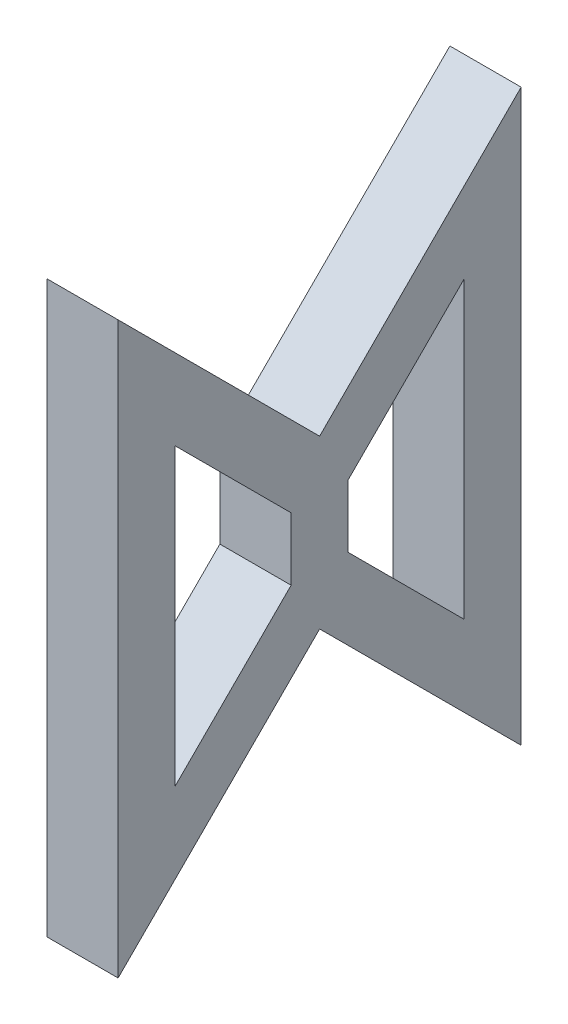
ISO-10303-21;
HEADER;
FILE_DESCRIPTION(('STEP AP214'),'2;1');
FILE_NAME('part.step','',(''),(''),'','','');
FILE_SCHEMA(('AUTOMOTIVE_DESIGN { 1 0 10303 214 1 1 1 1 }'));
ENDSEC;
DATA;
#1=APPLICATION_CONTEXT('core data for automotive mechanical design processes');
#2=APPLICATION_PROTOCOL_DEFINITION('international standard','automotive_design',2000,#1);
#3=PRODUCT_CONTEXT('',#1,'mechanical');
#4=PRODUCT('Part','Part','',(#3));
#5=PRODUCT_RELATED_PRODUCT_CATEGORY('part','',(#4));
#6=PRODUCT_DEFINITION_FORMATION('','',#4);
#7=PRODUCT_DEFINITION_CONTEXT('part definition',#1,'design');
#8=PRODUCT_DEFINITION('design','',#6,#7);
#9=PRODUCT_DEFINITION_SHAPE('','',#8);
#10=(LENGTH_UNIT() NAMED_UNIT(*) SI_UNIT(.MILLI.,.METRE.));
#11=(NAMED_UNIT(*) PLANE_ANGLE_UNIT() SI_UNIT($,.RADIAN.));
#12=(NAMED_UNIT(*) SI_UNIT($,.STERADIAN.) SOLID_ANGLE_UNIT());
#13=UNCERTAINTY_MEASURE_WITH_UNIT(LENGTH_MEASURE(1.E-05),#10,'distance_accuracy_value','');
#14=(GEOMETRIC_REPRESENTATION_CONTEXT(3) GLOBAL_UNCERTAINTY_ASSIGNED_CONTEXT((#13)) GLOBAL_UNIT_ASSIGNED_CONTEXT((#10,
#11,#12)) REPRESENTATION_CONTEXT('',''));
#15=CARTESIAN_POINT('',(0.,0.,0.));
#16=DIRECTION('',(0.,0.,1.));
#17=DIRECTION('',(1.,0.,0.));
#18=AXIS2_PLACEMENT_3D('',#15,#16,#17);
#19=CARTESIAN_POINT('',(5.,0.,0.));
#20=DIRECTION('',(0.,0.,-1.));
#21=DIRECTION('',(0.,1.,0.));
#22=AXIS2_PLACEMENT_3D('',#19,#20,#21);
#23=PLANE('',#22);
#24=DIRECTION('',(0.,-1.,0.));
#25=VECTOR('',#24,1.);
#26=CARTESIAN_POINT('',(0.,0.,0.));
#27=LINE('',#26,#25);
#28=CARTESIAN_POINT('',(0.,0.,0.));
#29=VERTEX_POINT('',#28);
#30=CARTESIAN_POINT('',(0.,-40.,0.));
#31=VERTEX_POINT('',#30);
#32=EDGE_CURVE('E196',#29,#31,#27,.T.);
#33=ORIENTED_EDGE('',*,*,#32,.T.);
#34=DIRECTION('',(-1.,0.,0.));
#35=VECTOR('',#34,1.);
#36=CARTESIAN_POINT('',(5.,-40.,0.));
#37=LINE('',#36,#35);
#38=CARTESIAN_POINT('',(5.,-40.,0.));
#39=VERTEX_POINT('',#38);
#40=EDGE_CURVE('E11',#39,#31,#37,.T.);
#41=ORIENTED_EDGE('',*,*,#40,.F.);
#42=DIRECTION('',(0.,-1.,0.));
#43=VECTOR('',#42,1.);
#44=CARTESIAN_POINT('',(5.,0.,0.));
#45=LINE('',#44,#43);
#46=CARTESIAN_POINT('',(5.,0.,0.));
#47=VERTEX_POINT('',#46);
#48=EDGE_CURVE('E203',#47,#39,#45,.T.);
#49=ORIENTED_EDGE('',*,*,#48,.F.);
#50=DIRECTION('',(-1.,0.,0.));
#51=VECTOR('',#50,1.);
#52=CARTESIAN_POINT('',(5.,0.,0.));
#53=LINE('',#52,#51);
#54=EDGE_CURVE('E220',#47,#29,#53,.T.);
#55=ORIENTED_EDGE('',*,*,#54,.T.);
#56=EDGE_LOOP('',(#33,#41,#49,#55));
#57=FACE_BOUND('',#56,.T.);
#58=ADVANCED_FACE('F35',(#57),#23,.F.);
#59=CARTESIAN_POINT('',(5.,-20.0000000000001,-20.));
#60=DIRECTION('',(0.,0.707106781186549,0.707106781186546));
#61=DIRECTION('',(0.,-0.707106781186546,0.707106781186549));
#62=AXIS2_PLACEMENT_3D('',#59,#60,#61);
#63=PLANE('',#62);
#64=DIRECTION('',(0.,0.707106781186546,-0.707106781186549));
#65=VECTOR('',#64,1.);
#66=CARTESIAN_POINT('',(0.,-20.0000000000001,-20.));
#67=LINE('',#66,#65);
#68=CARTESIAN_POINT('',(0.,-25.8578643762691,-14.142135623731));
#69=VERTEX_POINT('',#68);
#70=EDGE_CURVE('E223',#31,#69,#67,.T.);
#71=ORIENTED_EDGE('',*,*,#70,.T.);
#72=DIRECTION('',(-1.,0.,0.));
#73=VECTOR('',#72,1.);
#74=CARTESIAN_POINT('',(5.,-25.8578643762691,-14.142135623731));
#75=LINE('',#74,#73);
#76=CARTESIAN_POINT('',(5.,-25.8578643762691,-14.142135623731));
#77=VERTEX_POINT('',#76);
#78=EDGE_CURVE('E42',#77,#69,#75,.T.);
#79=ORIENTED_EDGE('',*,*,#78,.F.);
#80=DIRECTION('',(0.,0.707106781186546,-0.707106781186549));
#81=VECTOR('',#80,1.);
#82=CARTESIAN_POINT('',(5.,-20.0000000000001,-20.));
#83=LINE('',#82,#81);
#84=EDGE_CURVE('E206',#39,#77,#83,.T.);
#85=ORIENTED_EDGE('',*,*,#84,.F.);
#86=ORIENTED_EDGE('',*,*,#40,.T.);
#87=EDGE_LOOP('',(#71,#79,#85,#86));
#88=FACE_BOUND('',#87,.T.);
#89=ADVANCED_FACE('F269',(#88),#63,.F.);
#90=CARTESIAN_POINT('',(5.,-5.8578643762691,5.85786437626908));
#91=DIRECTION('',(0.,0.707106781186549,-0.707106781186546));
#92=DIRECTION('',(0.,0.707106781186546,0.707106781186549));
#93=AXIS2_PLACEMENT_3D('',#90,#91,#92);
#94=PLANE('',#93);
#95=DIRECTION('',(0.,-0.707106781186546,-0.707106781186549));
#96=VECTOR('',#95,1.);
#97=CARTESIAN_POINT('',(0.,-5.8578643762691,5.85786437626908));
#98=LINE('',#97,#96);
#99=CARTESIAN_POINT('',(0.,-40.,-28.2842712474619));
#100=VERTEX_POINT('',#99);
#101=EDGE_CURVE('E225',#69,#100,#98,.T.);
#102=ORIENTED_EDGE('',*,*,#101,.T.);
#103=DIRECTION('',(-1.,0.,0.));
#104=VECTOR('',#103,1.);
#105=CARTESIAN_POINT('',(5.,-40.,-28.2842712474619));
#106=LINE('',#105,#104);
#107=CARTESIAN_POINT('',(5.,-40.,-28.2842712474619));
#108=VERTEX_POINT('',#107);
#109=EDGE_CURVE('E241',#108,#100,#106,.T.);
#110=ORIENTED_EDGE('',*,*,#109,.F.);
#111=DIRECTION('',(0.,-0.707106781186546,-0.707106781186549));
#112=VECTOR('',#111,1.);
#113=CARTESIAN_POINT('',(5.,-5.8578643762691,5.85786437626908));
#114=LINE('',#113,#112);
#115=EDGE_CURVE('E209',#77,#108,#114,.T.);
#116=ORIENTED_EDGE('',*,*,#115,.F.);
#117=ORIENTED_EDGE('',*,*,#78,.T.);
#118=EDGE_LOOP('',(#102,#110,#116,#117));
#119=FACE_BOUND('',#118,.T.);
#120=ADVANCED_FACE('F247',(#119),#94,.F.);
#121=CARTESIAN_POINT('',(5.,0.,-28.2842712474619));
#122=DIRECTION('',(0.,0.,-1.));
#123=DIRECTION('',(-1.,0.,0.));
#124=AXIS2_PLACEMENT_3D('',#121,#122,#123);
#125=PLANE('',#124);
#126=DIRECTION('',(0.,-1.,0.));
#127=VECTOR('',#126,1.);
#128=CARTESIAN_POINT('',(0.,0.,-28.2842712474619));
#129=LINE('',#128,#127);
#130=CARTESIAN_POINT('',(0.,0.,-28.2842712474619));
#131=VERTEX_POINT('',#130);
#132=EDGE_CURVE('E228',#131,#100,#129,.T.);
#133=ORIENTED_EDGE('',*,*,#132,.F.);
#134=DIRECTION('',(-1.,0.,0.));
#135=VECTOR('',#134,1.);
#136=CARTESIAN_POINT('',(5.,0.,-28.2842712474619));
#137=LINE('',#136,#135);
#138=CARTESIAN_POINT('',(5.,0.,-28.2842712474619));
#139=VERTEX_POINT('',#138);
#140=EDGE_CURVE('E239',#139,#131,#137,.T.);
#141=ORIENTED_EDGE('',*,*,#140,.F.);
#142=DIRECTION('',(0.,-1.,0.));
#143=VECTOR('',#142,1.);
#144=CARTESIAN_POINT('',(5.,0.,-28.2842712474619));
#145=LINE('',#144,#143);
#146=EDGE_CURVE('E211',#139,#108,#145,.T.);
#147=ORIENTED_EDGE('',*,*,#146,.T.);
#148=ORIENTED_EDGE('',*,*,#109,.T.);
#149=EDGE_LOOP('',(#133,#141,#147,#148));
#150=FACE_BOUND('',#149,.T.);
#151=ADVANCED_FACE('F255',(#150),#125,.T.);
#152=CARTESIAN_POINT('',(5.,-14.142135623731,-14.1421356237309));
#153=DIRECTION('',(0.,0.707106781186549,0.707106781186546));
#154=DIRECTION('',(0.,-0.707106781186546,0.707106781186549));
#155=AXIS2_PLACEMENT_3D('',#152,#153,#154);
#156=PLANE('',#155);
#157=DIRECTION('',(0.,0.707106781186546,-0.707106781186549));
#158=VECTOR('',#157,1.);
#159=CARTESIAN_POINT('',(0.,-14.142135623731,-14.1421356237309));
#160=LINE('',#159,#158);
#161=CARTESIAN_POINT('',(0.,-14.1421356237309,-14.142135623731));
#162=VERTEX_POINT('',#161);
#163=EDGE_CURVE('E231',#162,#131,#160,.T.);
#164=ORIENTED_EDGE('',*,*,#163,.F.);
#165=DIRECTION('',(-1.,0.,0.));
#166=VECTOR('',#165,1.);
#167=CARTESIAN_POINT('',(5.,-14.1421356237309,-14.142135623731));
#168=LINE('',#167,#166);
#169=CARTESIAN_POINT('',(5.,-14.1421356237309,-14.142135623731));
#170=VERTEX_POINT('',#169);
#171=EDGE_CURVE('E237',#170,#162,#168,.T.);
#172=ORIENTED_EDGE('',*,*,#171,.F.);
#173=DIRECTION('',(0.,0.707106781186546,-0.707106781186549));
#174=VECTOR('',#173,1.);
#175=CARTESIAN_POINT('',(5.,-14.142135623731,-14.1421356237309));
#176=LINE('',#175,#174);
#177=EDGE_CURVE('E214',#170,#139,#176,.T.);
#178=ORIENTED_EDGE('',*,*,#177,.T.);
#179=ORIENTED_EDGE('',*,*,#140,.T.);
#180=EDGE_LOOP('',(#164,#172,#178,#179));
#181=FACE_BOUND('',#180,.T.);
#182=ADVANCED_FACE('F262',(#181),#156,.T.);
#183=CARTESIAN_POINT('',(5.,0.,0.));
#184=DIRECTION('',(0.,0.707106781186549,-0.707106781186546));
#185=DIRECTION('',(0.,0.707106781186546,0.707106781186549));
#186=AXIS2_PLACEMENT_3D('',#183,#184,#185);
#187=PLANE('',#186);
#188=DIRECTION('',(0.,-0.707106781186546,-0.707106781186549));
#189=VECTOR('',#188,1.);
#190=CARTESIAN_POINT('',(0.,0.,0.));
#191=LINE('',#190,#189);
#192=EDGE_CURVE('E207',#29,#162,#191,.T.);
#193=ORIENTED_EDGE('',*,*,#192,.F.);
#194=ORIENTED_EDGE('',*,*,#54,.F.);
#195=DIRECTION('',(0.,-0.707106781186546,-0.707106781186549));
#196=VECTOR('',#195,1.);
#197=CARTESIAN_POINT('',(5.,0.,0.));
#198=LINE('',#197,#196);
#199=EDGE_CURVE('E217',#47,#170,#198,.T.);
#200=ORIENTED_EDGE('',*,*,#199,.T.);
#201=ORIENTED_EDGE('',*,*,#171,.T.);
#202=EDGE_LOOP('',(#193,#194,#200,#201));
#203=FACE_BOUND('',#202,.T.);
#204=ADVANCED_FACE('F265',(#203),#187,.T.);
#205=CARTESIAN_POINT('',(5.,0.,0.));
#206=DIRECTION('',(1.,0.,0.));
#207=DIRECTION('',(0.,0.,-1.));
#208=AXIS2_PLACEMENT_3D('',#205,#206,#207);
#209=PLANE('',#208);
#210=DIRECTION('',(0.,1.,0.));
#211=VECTOR('',#210,1.);
#212=CARTESIAN_POINT('',(5.,0.,-24.2842712474619));
#213=LINE('',#212,#211);
#214=CARTESIAN_POINT('',(5.,-30.3431457505076,-24.2842712474619));
#215=VERTEX_POINT('',#214);
#216=CARTESIAN_POINT('',(5.,-9.65685424949236,-24.2842712474619));
#217=VERTEX_POINT('',#216);
#218=EDGE_CURVE('E49',#215,#217,#213,.T.);
#219=ORIENTED_EDGE('',*,*,#218,.F.);
#220=DIRECTION('',(0.,-0.707106781186546,-0.707106781186549));
#221=VECTOR('',#220,1.);
#222=CARTESIAN_POINT('',(5.,-3.0294372515229,3.02943725152289));
#223=LINE('',#222,#221);
#224=CARTESIAN_POINT('',(5.,-22.2010101267767,-16.142135623731));
#225=VERTEX_POINT('',#224);
#226=EDGE_CURVE('E152',#225,#215,#223,.T.);
#227=ORIENTED_EDGE('',*,*,#226,.F.);
#228=DIRECTION('',(0.,1.,0.));
#229=VECTOR('',#228,1.);
#230=CARTESIAN_POINT('',(5.,0.,-16.142135623731));
#231=LINE('',#230,#229);
#232=CARTESIAN_POINT('',(5.,-17.7989898732233,-16.142135623731));
#233=VERTEX_POINT('',#232);
#234=EDGE_CURVE('E155',#225,#233,#231,.T.);
#235=ORIENTED_EDGE('',*,*,#234,.T.);
#236=DIRECTION('',(0.,-0.707106781186546,0.707106781186549));
#237=VECTOR('',#236,1.);
#238=CARTESIAN_POINT('',(5.,-16.9705627484772,-16.9705627484771));
#239=LINE('',#238,#237);
#240=EDGE_CURVE('E161',#217,#233,#239,.T.);
#241=ORIENTED_EDGE('',*,*,#240,.F.);
#242=EDGE_LOOP('',(#219,#227,#235,#241));
#243=FACE_BOUND('',#242,.T.);
#244=DIRECTION('',(0.,1.,0.));
#245=VECTOR('',#244,1.);
#246=CARTESIAN_POINT('',(5.,0.,-12.142135623731));
#247=LINE('',#246,#245);
#248=CARTESIAN_POINT('',(5.,-22.2010101267767,-12.142135623731));
#249=VERTEX_POINT('',#248);
#250=CARTESIAN_POINT('',(5.,-17.7989898732233,-12.142135623731));
#251=VERTEX_POINT('',#250);
#252=EDGE_CURVE('E167',#249,#251,#247,.T.);
#253=ORIENTED_EDGE('',*,*,#252,.F.);
#254=DIRECTION('',(0.,0.707106781186546,-0.707106781186549));
#255=VECTOR('',#254,1.);
#256=CARTESIAN_POINT('',(5.,-17.1715728752539,-17.1715728752538));
#257=LINE('',#256,#255);
#258=CARTESIAN_POINT('',(5.,-30.3431457505076,-4.));
#259=VERTEX_POINT('',#258);
#260=EDGE_CURVE('E175',#259,#249,#257,.T.);
#261=ORIENTED_EDGE('',*,*,#260,.F.);
#262=DIRECTION('',(0.,-1.,0.));
#263=VECTOR('',#262,1.);
#264=CARTESIAN_POINT('',(5.,0.,-4.));
#265=LINE('',#264,#263);
#266=CARTESIAN_POINT('',(5.,-9.65685424949236,-4.));
#267=VERTEX_POINT('',#266);
#268=EDGE_CURVE('E189',#267,#259,#265,.T.);
#269=ORIENTED_EDGE('',*,*,#268,.F.);
#270=DIRECTION('',(0.,0.707106781186546,0.707106781186549));
#271=VECTOR('',#270,1.);
#272=CARTESIAN_POINT('',(5.,-2.82842712474619,2.82842712474618));
#273=LINE('',#272,#271);
#274=EDGE_CURVE('E186',#251,#267,#273,.T.);
#275=ORIENTED_EDGE('',*,*,#274,.F.);
#276=EDGE_LOOP('',(#253,#261,#269,#275));
#277=FACE_BOUND('',#276,.T.);
#278=ORIENTED_EDGE('',*,*,#48,.T.);
#279=ORIENTED_EDGE('',*,*,#84,.T.);
#280=ORIENTED_EDGE('',*,*,#115,.T.);
#281=ORIENTED_EDGE('',*,*,#146,.F.);
#282=ORIENTED_EDGE('',*,*,#177,.F.);
#283=ORIENTED_EDGE('',*,*,#199,.F.);
#284=EDGE_LOOP('',(#278,#279,#280,#281,#282,#283));
#285=FACE_BOUND('',#284,.T.);
#286=ADVANCED_FACE('F259',(#243,#277,#285),#209,.T.);
#287=CARTESIAN_POINT('',(0.,0.,0.));
#288=DIRECTION('',(1.,0.,0.));
#289=DIRECTION('',(0.,0.,-1.));
#290=AXIS2_PLACEMENT_3D('',#287,#288,#289);
#291=PLANE('',#290);
#292=DIRECTION('',(0.,-0.707106781186546,-0.707106781186549));
#293=VECTOR('',#292,1.);
#294=CARTESIAN_POINT('',(0.,-3.0294372515229,3.02943725152289));
#295=LINE('',#294,#293);
#296=CARTESIAN_POINT('',(0.,-22.2010101267767,-16.142135623731));
#297=VERTEX_POINT('',#296);
#298=CARTESIAN_POINT('',(0.,-30.3431457505076,-24.2842712474619));
#299=VERTEX_POINT('',#298);
#300=EDGE_CURVE('E140',#297,#299,#295,.T.);
#301=ORIENTED_EDGE('',*,*,#300,.T.);
#302=DIRECTION('',(0.,1.,0.));
#303=VECTOR('',#302,1.);
#304=CARTESIAN_POINT('',(0.,0.,-24.2842712474619));
#305=LINE('',#304,#303);
#306=CARTESIAN_POINT('',(0.,-9.65685424949236,-24.2842712474619));
#307=VERTEX_POINT('',#306);
#308=EDGE_CURVE('E137',#299,#307,#305,.T.);
#309=ORIENTED_EDGE('',*,*,#308,.T.);
#310=DIRECTION('',(0.,-0.707106781186546,0.707106781186549));
#311=VECTOR('',#310,1.);
#312=CARTESIAN_POINT('',(0.,-16.9705627484772,-16.9705627484771));
#313=LINE('',#312,#311);
#314=CARTESIAN_POINT('',(0.,-17.7989898732233,-16.142135623731));
#315=VERTEX_POINT('',#314);
#316=EDGE_CURVE('E143',#307,#315,#313,.T.);
#317=ORIENTED_EDGE('',*,*,#316,.T.);
#318=DIRECTION('',(0.,1.,0.));
#319=VECTOR('',#318,1.);
#320=CARTESIAN_POINT('',(0.,0.,-16.142135623731));
#321=LINE('',#320,#319);
#322=EDGE_CURVE('E147',#297,#315,#321,.T.);
#323=ORIENTED_EDGE('',*,*,#322,.F.);
#324=EDGE_LOOP('',(#301,#309,#317,#323));
#325=FACE_BOUND('',#324,.T.);
#326=DIRECTION('',(0.,0.707106781186546,-0.707106781186549));
#327=VECTOR('',#326,1.);
#328=CARTESIAN_POINT('',(0.,-17.1715728752539,-17.1715728752538));
#329=LINE('',#328,#327);
#330=CARTESIAN_POINT('',(0.,-30.3431457505076,-4.));
#331=VERTEX_POINT('',#330);
#332=CARTESIAN_POINT('',(0.,-22.2010101267767,-12.142135623731));
#333=VERTEX_POINT('',#332);
#334=EDGE_CURVE('E181',#331,#333,#329,.T.);
#335=ORIENTED_EDGE('',*,*,#334,.T.);
#336=DIRECTION('',(0.,1.,0.));
#337=VECTOR('',#336,1.);
#338=CARTESIAN_POINT('',(0.,0.,-12.142135623731));
#339=LINE('',#338,#337);
#340=CARTESIAN_POINT('',(0.,-17.7989898732233,-12.142135623731));
#341=VERTEX_POINT('',#340);
#342=EDGE_CURVE('E171',#333,#341,#339,.T.);
#343=ORIENTED_EDGE('',*,*,#342,.T.);
#344=DIRECTION('',(0.,0.707106781186546,0.707106781186549));
#345=VECTOR('',#344,1.);
#346=CARTESIAN_POINT('',(0.,-2.82842712474619,2.82842712474618));
#347=LINE('',#346,#345);
#348=CARTESIAN_POINT('',(0.,-9.65685424949236,-4.));
#349=VERTEX_POINT('',#348);
#350=EDGE_CURVE('E174',#341,#349,#347,.T.);
#351=ORIENTED_EDGE('',*,*,#350,.T.);
#352=DIRECTION('',(0.,-1.,0.));
#353=VECTOR('',#352,1.);
#354=CARTESIAN_POINT('',(0.,0.,-4.));
#355=LINE('',#354,#353);
#356=EDGE_CURVE('E178',#349,#331,#355,.T.);
#357=ORIENTED_EDGE('',*,*,#356,.T.);
#358=EDGE_LOOP('',(#335,#343,#351,#357));
#359=FACE_BOUND('',#358,.T.);
#360=ORIENTED_EDGE('',*,*,#32,.F.);
#361=ORIENTED_EDGE('',*,*,#192,.T.);
#362=ORIENTED_EDGE('',*,*,#163,.T.);
#363=ORIENTED_EDGE('',*,*,#132,.T.);
#364=ORIENTED_EDGE('',*,*,#101,.F.);
#365=ORIENTED_EDGE('',*,*,#70,.F.);
#366=EDGE_LOOP('',(#360,#361,#362,#363,#364,#365));
#367=FACE_BOUND('',#366,.T.);
#368=ADVANCED_FACE('F149',(#325,#359,#367),#291,.F.);
#369=CARTESIAN_POINT('',(0.,0.,-12.142135623731));
#370=DIRECTION('',(0.,0.,-1.));
#371=DIRECTION('',(-1.,0.,0.));
#372=AXIS2_PLACEMENT_3D('',#369,#370,#371);
#373=PLANE('',#372);
#374=ORIENTED_EDGE('',*,*,#252,.T.);
#375=DIRECTION('',(1.,0.,0.));
#376=VECTOR('',#375,1.);
#377=CARTESIAN_POINT('',(0.,-17.7989898732233,-12.142135623731));
#378=LINE('',#377,#376);
#379=EDGE_CURVE('E184',#341,#251,#378,.T.);
#380=ORIENTED_EDGE('',*,*,#379,.F.);
#381=ORIENTED_EDGE('',*,*,#342,.F.);
#382=DIRECTION('',(1.,0.,0.));
#383=VECTOR('',#382,1.);
#384=CARTESIAN_POINT('',(0.,-22.2010101267767,-12.142135623731));
#385=LINE('',#384,#383);
#386=EDGE_CURVE('E194',#333,#249,#385,.T.);
#387=ORIENTED_EDGE('',*,*,#386,.T.);
#388=EDGE_LOOP('',(#374,#380,#381,#387));
#389=FACE_BOUND('',#388,.T.);
#390=ADVANCED_FACE('F285',(#389),#373,.F.);
#391=CARTESIAN_POINT('',(0.,-17.1715728752539,-17.1715728752538));
#392=DIRECTION('',(0.,-0.707106781186549,-0.707106781186546));
#393=DIRECTION('',(0.,0.707106781186546,-0.707106781186549));
#394=AXIS2_PLACEMENT_3D('',#391,#392,#393);
#395=PLANE('',#394);
#396=ORIENTED_EDGE('',*,*,#260,.T.);
#397=ORIENTED_EDGE('',*,*,#386,.F.);
#398=ORIENTED_EDGE('',*,*,#334,.F.);
#399=DIRECTION('',(1.,0.,0.));
#400=VECTOR('',#399,1.);
#401=CARTESIAN_POINT('',(0.,-30.3431457505076,-4.));
#402=LINE('',#401,#400);
#403=EDGE_CURVE('E197',#331,#259,#402,.T.);
#404=ORIENTED_EDGE('',*,*,#403,.T.);
#405=EDGE_LOOP('',(#396,#397,#398,#404));
#406=FACE_BOUND('',#405,.T.);
#407=ADVANCED_FACE('F291',(#406),#395,.F.);
#408=CARTESIAN_POINT('',(0.,0.,-4.));
#409=DIRECTION('',(0.,0.,1.));
#410=DIRECTION('',(0.,-1.,0.));
#411=AXIS2_PLACEMENT_3D('',#408,#409,#410);
#412=PLANE('',#411);
#413=ORIENTED_EDGE('',*,*,#268,.T.);
#414=ORIENTED_EDGE('',*,*,#403,.F.);
#415=ORIENTED_EDGE('',*,*,#356,.F.);
#416=DIRECTION('',(1.,0.,0.));
#417=VECTOR('',#416,1.);
#418=CARTESIAN_POINT('',(0.,-9.65685424949236,-4.));
#419=LINE('',#418,#417);
#420=EDGE_CURVE('E199',#349,#267,#419,.T.);
#421=ORIENTED_EDGE('',*,*,#420,.T.);
#422=EDGE_LOOP('',(#413,#414,#415,#421));
#423=FACE_BOUND('',#422,.T.);
#424=ADVANCED_FACE('F296',(#423),#412,.F.);
#425=CARTESIAN_POINT('',(0.,-2.82842712474619,2.82842712474618));
#426=DIRECTION('',(0.,0.707106781186549,-0.707106781186546));
#427=DIRECTION('',(0.,0.707106781186546,0.707106781186549));
#428=AXIS2_PLACEMENT_3D('',#425,#426,#427);
#429=PLANE('',#428);
#430=ORIENTED_EDGE('',*,*,#274,.T.);
#431=ORIENTED_EDGE('',*,*,#420,.F.);
#432=ORIENTED_EDGE('',*,*,#350,.F.);
#433=ORIENTED_EDGE('',*,*,#379,.T.);
#434=EDGE_LOOP('',(#430,#431,#432,#433));
#435=FACE_BOUND('',#434,.T.);
#436=ADVANCED_FACE('F293',(#435),#429,.F.);
#437=CARTESIAN_POINT('',(0.,0.,-24.2842712474619));
#438=DIRECTION('',(0.,0.,-1.));
#439=DIRECTION('',(-1.,0.,0.));
#440=AXIS2_PLACEMENT_3D('',#437,#438,#439);
#441=PLANE('',#440);
#442=ORIENTED_EDGE('',*,*,#218,.T.);
#443=DIRECTION('',(1.,0.,0.));
#444=VECTOR('',#443,1.);
#445=CARTESIAN_POINT('',(0.,-9.65685424949236,-24.2842712474619));
#446=LINE('',#445,#444);
#447=EDGE_CURVE('E134',#307,#217,#446,.T.);
#448=ORIENTED_EDGE('',*,*,#447,.F.);
#449=ORIENTED_EDGE('',*,*,#308,.F.);
#450=DIRECTION('',(1.,0.,0.));
#451=VECTOR('',#450,1.);
#452=CARTESIAN_POINT('',(0.,-30.3431457505076,-24.2842712474619));
#453=LINE('',#452,#451);
#454=EDGE_CURVE('E165',#299,#215,#453,.T.);
#455=ORIENTED_EDGE('',*,*,#454,.T.);
#456=EDGE_LOOP('',(#442,#448,#449,#455));
#457=FACE_BOUND('',#456,.T.);
#458=ADVANCED_FACE('F135',(#457),#441,.F.);
#459=CARTESIAN_POINT('',(0.,-3.0294372515229,3.02943725152289));
#460=DIRECTION('',(0.,-0.707106781186549,0.707106781186546));
#461=DIRECTION('',(0.,-0.707106781186546,-0.707106781186549));
#462=AXIS2_PLACEMENT_3D('',#459,#460,#461);
#463=PLANE('',#462);
#464=ORIENTED_EDGE('',*,*,#226,.T.);
#465=ORIENTED_EDGE('',*,*,#454,.F.);
#466=ORIENTED_EDGE('',*,*,#300,.F.);
#467=DIRECTION('',(1.,0.,0.));
#468=VECTOR('',#467,1.);
#469=CARTESIAN_POINT('',(0.,-22.2010101267767,-16.142135623731));
#470=LINE('',#469,#468);
#471=EDGE_CURVE('E168',#297,#225,#470,.T.);
#472=ORIENTED_EDGE('',*,*,#471,.T.);
#473=EDGE_LOOP('',(#464,#465,#466,#472));
#474=FACE_BOUND('',#473,.T.);
#475=ADVANCED_FACE('F306',(#474),#463,.F.);
#476=CARTESIAN_POINT('',(0.,0.,-16.142135623731));
#477=DIRECTION('',(0.,0.,-1.));
#478=DIRECTION('',(-1.,0.,0.));
#479=AXIS2_PLACEMENT_3D('',#476,#477,#478);
#480=PLANE('',#479);
#481=ORIENTED_EDGE('',*,*,#234,.F.);
#482=ORIENTED_EDGE('',*,*,#471,.F.);
#483=ORIENTED_EDGE('',*,*,#322,.T.);
#484=DIRECTION('',(1.,0.,0.));
#485=VECTOR('',#484,1.);
#486=CARTESIAN_POINT('',(0.,-17.7989898732233,-16.142135623731));
#487=LINE('',#486,#485);
#488=EDGE_CURVE('E57',#315,#233,#487,.T.);
#489=ORIENTED_EDGE('',*,*,#488,.T.);
#490=EDGE_LOOP('',(#481,#482,#483,#489));
#491=FACE_BOUND('',#490,.T.);
#492=ADVANCED_FACE('F309',(#491),#480,.T.);
#493=CARTESIAN_POINT('',(0.,-16.9705627484772,-16.9705627484771));
#494=DIRECTION('',(0.,0.707106781186549,0.707106781186546));
#495=DIRECTION('',(0.,-0.707106781186546,0.707106781186549));
#496=AXIS2_PLACEMENT_3D('',#493,#494,#495);
#497=PLANE('',#496);
#498=ORIENTED_EDGE('',*,*,#240,.T.);
#499=ORIENTED_EDGE('',*,*,#488,.F.);
#500=ORIENTED_EDGE('',*,*,#316,.F.);
#501=ORIENTED_EDGE('',*,*,#447,.T.);
#502=EDGE_LOOP('',(#498,#499,#500,#501));
#503=FACE_BOUND('',#502,.T.);
#504=ADVANCED_FACE('F144',(#503),#497,.F.);
#505=CLOSED_SHELL('',(#58,#89,#120,#151,#182,#204,#286,#368,#390,#407,#424,#436,#458,#475,#492,#504));
#506=MANIFOLD_SOLID_BREP('B2',#505);
#507=ADVANCED_BREP_SHAPE_REPRESENTATION('',(#18,#506),#14);
#508=SHAPE_DEFINITION_REPRESENTATION(#9,#507);
ENDSEC;
END-ISO-10303-21;
